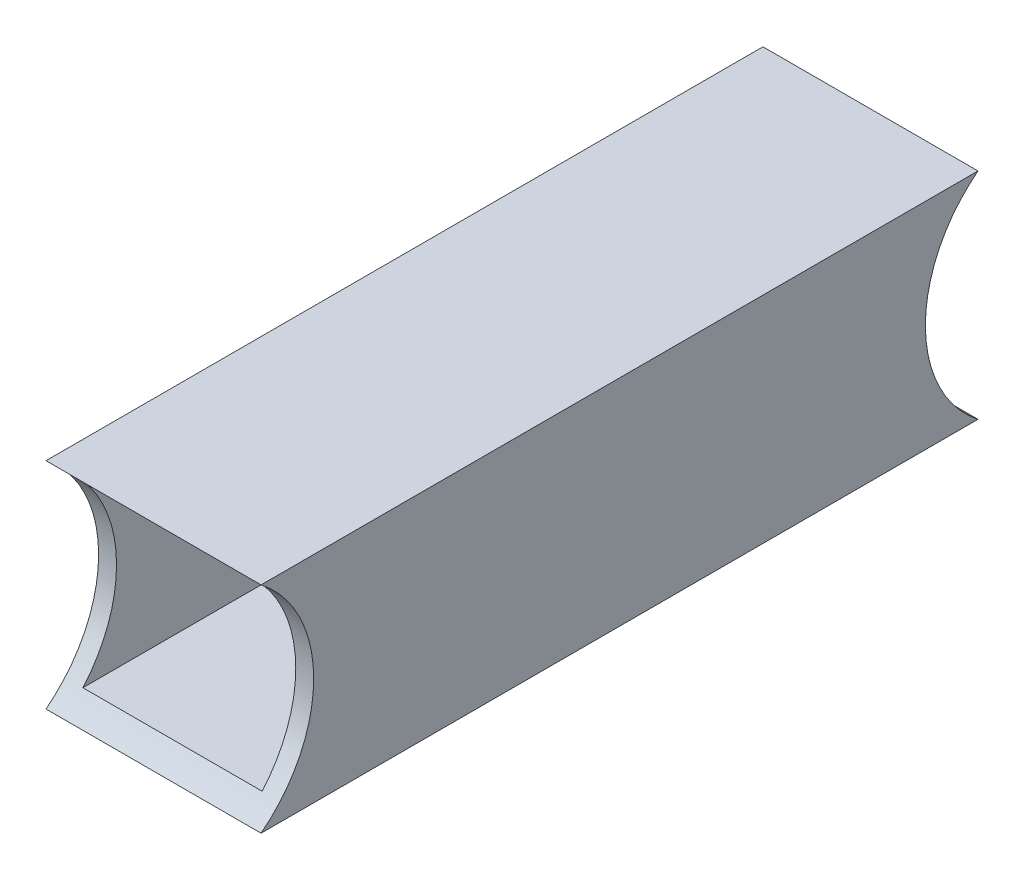
ISO-10303-21;
HEADER;
FILE_DESCRIPTION(('STEP AP214'),'2;1');
FILE_NAME('part.step','',(''),(''),'','','');
FILE_SCHEMA(('AUTOMOTIVE_DESIGN { 1 0 10303 214 1 1 1 1 }'));
ENDSEC;
DATA;
#1=APPLICATION_CONTEXT('core data for automotive mechanical design processes');
#2=APPLICATION_PROTOCOL_DEFINITION('international standard','automotive_design',2000,#1);
#3=PRODUCT_CONTEXT('',#1,'mechanical');
#4=PRODUCT('Part','Part','',(#3));
#5=PRODUCT_RELATED_PRODUCT_CATEGORY('part','',(#4));
#6=PRODUCT_DEFINITION_FORMATION('','',#4);
#7=PRODUCT_DEFINITION_CONTEXT('part definition',#1,'design');
#8=PRODUCT_DEFINITION('design','',#6,#7);
#9=PRODUCT_DEFINITION_SHAPE('','',#8);
#10=(LENGTH_UNIT() NAMED_UNIT(*) SI_UNIT(.MILLI.,.METRE.));
#11=(NAMED_UNIT(*) PLANE_ANGLE_UNIT() SI_UNIT($,.RADIAN.));
#12=(NAMED_UNIT(*) SI_UNIT($,.STERADIAN.) SOLID_ANGLE_UNIT());
#13=UNCERTAINTY_MEASURE_WITH_UNIT(LENGTH_MEASURE(1.E-05),#10,'distance_accuracy_value','');
#14=(GEOMETRIC_REPRESENTATION_CONTEXT(3) GLOBAL_UNCERTAINTY_ASSIGNED_CONTEXT((#13)) GLOBAL_UNIT_ASSIGNED_CONTEXT((#10,
#11,#12)) REPRESENTATION_CONTEXT('',''));
#15=CARTESIAN_POINT('',(0.,0.,0.));
#16=DIRECTION('',(0.,0.,1.));
#17=DIRECTION('',(1.,0.,0.));
#18=AXIS2_PLACEMENT_3D('',#15,#16,#17);
#19=CARTESIAN_POINT('',(38.1,19.05,-156.62402));
#20=DIRECTION('',(-1.,0.,0.));
#21=DIRECTION('',(0.,0.,1.));
#22=AXIS2_PLACEMENT_3D('',#19,#20,#21);
#23=CYLINDRICAL_SURFACE('',#22,24.13);
#24=DIRECTION('',(-1.,0.,0.));
#25=VECTOR('',#24,1.);
#26=CARTESIAN_POINT('',(38.1,34.925,-138.451478213007));
#27=LINE('',#26,#25);
#28=CARTESIAN_POINT('',(3.175,34.925,-138.451478213007));
#29=VERTEX_POINT('',#28);
#30=CARTESIAN_POINT('',(34.925,34.925,-138.451478213007));
#31=VERTEX_POINT('',#30);
#32=EDGE_CURVE('E106',#29,#31,#27,.F.);
#33=ORIENTED_EDGE('',*,*,#32,.F.);
#34=CARTESIAN_POINT('',(3.175,19.05,-156.62402));
#35=DIRECTION('',(-1.,0.,0.));
#36=DIRECTION('',(0.,0.,1.));
#37=AXIS2_PLACEMENT_3D('',#34,#35,#36);
#38=CIRCLE('',#37,24.13);
#39=CARTESIAN_POINT('',(3.175,3.175,-138.451478213007));
#40=VERTEX_POINT('',#39);
#41=EDGE_CURVE('E95',#40,#29,#38,.T.);
#42=ORIENTED_EDGE('',*,*,#41,.F.);
#43=DIRECTION('',(-1.,0.,0.));
#44=VECTOR('',#43,1.);
#45=CARTESIAN_POINT('',(38.1,3.175,-138.451478213007));
#46=LINE('',#45,#44);
#47=CARTESIAN_POINT('',(34.925,3.175,-138.451478213007));
#48=VERTEX_POINT('',#47);
#49=EDGE_CURVE('E100',#48,#40,#46,.T.);
#50=ORIENTED_EDGE('',*,*,#49,.F.);
#51=CARTESIAN_POINT('',(34.925,19.05,-156.62402));
#52=DIRECTION('',(1.,0.,0.));
#53=DIRECTION('',(0.,0.,-1.));
#54=AXIS2_PLACEMENT_3D('',#51,#52,#53);
#55=CIRCLE('',#54,24.13);
#56=EDGE_CURVE('E113',#31,#48,#55,.T.);
#57=ORIENTED_EDGE('',*,*,#56,.F.);
#58=EDGE_LOOP('',(#33,#42,#50,#57));
#59=FACE_BOUND('',#58,.T.);
#60=CARTESIAN_POINT('',(0.,19.05,-156.62402));
#61=DIRECTION('',(1.,0.,0.));
#62=DIRECTION('',(0.,0.,-1.));
#63=AXIS2_PLACEMENT_3D('',#60,#61,#62);
#64=CIRCLE('',#63,24.13);
#65=CARTESIAN_POINT('',(0.,38.1,-141.813402187093));
#66=VERTEX_POINT('',#65);
#67=CARTESIAN_POINT('',(0.,0.,-141.813402187093));
#68=VERTEX_POINT('',#67);
#69=EDGE_CURVE('E114',#66,#68,#64,.T.);
#70=ORIENTED_EDGE('',*,*,#69,.F.);
#71=DIRECTION('',(-1.,0.,0.));
#72=VECTOR('',#71,1.);
#73=CARTESIAN_POINT('',(38.1,38.1,-141.813402187093));
#74=LINE('',#73,#72);
#75=CARTESIAN_POINT('',(38.1,38.1,-141.813402187093));
#76=VERTEX_POINT('',#75);
#77=EDGE_CURVE('E147',#76,#66,#74,.T.);
#78=ORIENTED_EDGE('',*,*,#77,.F.);
#79=CARTESIAN_POINT('',(38.1,19.05,-156.62402));
#80=DIRECTION('',(1.,0.,0.));
#81=DIRECTION('',(0.,0.,-1.));
#82=AXIS2_PLACEMENT_3D('',#79,#80,#81);
#83=CIRCLE('',#82,24.13);
#84=CARTESIAN_POINT('',(38.1,0.,-141.813402187093));
#85=VERTEX_POINT('',#84);
#86=EDGE_CURVE('E122',#76,#85,#83,.T.);
#87=ORIENTED_EDGE('',*,*,#86,.T.);
#88=DIRECTION('',(-1.,0.,0.));
#89=VECTOR('',#88,1.);
#90=CARTESIAN_POINT('',(38.1,0.,-141.813402187093));
#91=LINE('',#90,#89);
#92=EDGE_CURVE('E133',#85,#68,#91,.T.);
#93=ORIENTED_EDGE('',*,*,#92,.T.);
#94=EDGE_LOOP('',(#70,#78,#87,#93));
#95=FACE_BOUND('',#94,.T.);
#96=ADVANCED_FACE('F35',(#59,#95),#23,.F.);
#97=CARTESIAN_POINT('',(38.1,38.1,0.));
#98=DIRECTION('',(0.,1.,0.));
#99=DIRECTION('',(0.,0.,1.));
#100=AXIS2_PLACEMENT_3D('',#97,#98,#99);
#101=PLANE('',#100);
#102=DIRECTION('',(0.,0.,-1.));
#103=VECTOR('',#102,1.);
#104=CARTESIAN_POINT('',(0.,38.1,0.));
#105=LINE('',#104,#103);
#106=CARTESIAN_POINT('',(0.,38.1,-14.8106178129071));
#107=VERTEX_POINT('',#106);
#108=EDGE_CURVE('E117',#107,#66,#105,.T.);
#109=ORIENTED_EDGE('',*,*,#108,.F.);
#110=DIRECTION('',(-1.,0.,0.));
#111=VECTOR('',#110,1.);
#112=CARTESIAN_POINT('',(38.1,38.1,-14.8106178129071));
#113=LINE('',#112,#111);
#114=CARTESIAN_POINT('',(38.1,38.1,-14.8106178129071));
#115=VERTEX_POINT('',#114);
#116=EDGE_CURVE('E145',#115,#107,#113,.T.);
#117=ORIENTED_EDGE('',*,*,#116,.F.);
#118=DIRECTION('',(0.,0.,-1.));
#119=VECTOR('',#118,1.);
#120=CARTESIAN_POINT('',(38.1,38.1,0.));
#121=LINE('',#120,#119);
#122=EDGE_CURVE('E125',#115,#76,#121,.T.);
#123=ORIENTED_EDGE('',*,*,#122,.T.);
#124=ORIENTED_EDGE('',*,*,#77,.T.);
#125=EDGE_LOOP('',(#109,#117,#123,#124));
#126=FACE_BOUND('',#125,.T.);
#127=ADVANCED_FACE('F176',(#126),#101,.T.);
#128=CARTESIAN_POINT('',(38.1,19.05,0.));
#129=DIRECTION('',(-1.,0.,0.));
#130=DIRECTION('',(0.,0.,1.));
#131=AXIS2_PLACEMENT_3D('',#128,#129,#130);
#132=CYLINDRICAL_SURFACE('',#131,24.13);
#133=DIRECTION('',(-1.,0.,0.));
#134=VECTOR('',#133,1.);
#135=CARTESIAN_POINT('',(38.1,34.925,-18.1725417869928));
#136=LINE('',#135,#134);
#137=CARTESIAN_POINT('',(34.925,34.925,-18.1725417869928));
#138=VERTEX_POINT('',#137);
#139=CARTESIAN_POINT('',(3.175,34.925,-18.1725417869928));
#140=VERTEX_POINT('',#139);
#141=EDGE_CURVE('E11',#138,#140,#136,.T.);
#142=ORIENTED_EDGE('',*,*,#141,.F.);
#143=CARTESIAN_POINT('',(34.925,19.05,0.));
#144=DIRECTION('',(1.,0.,0.));
#145=DIRECTION('',(0.,0.,-1.));
#146=AXIS2_PLACEMENT_3D('',#143,#144,#145);
#147=CIRCLE('',#146,24.13);
#148=CARTESIAN_POINT('',(34.925,3.175,-18.1725417869928));
#149=VERTEX_POINT('',#148);
#150=EDGE_CURVE('E42',#149,#138,#147,.T.);
#151=ORIENTED_EDGE('',*,*,#150,.F.);
#152=DIRECTION('',(-1.,0.,0.));
#153=VECTOR('',#152,1.);
#154=CARTESIAN_POINT('',(38.1,3.175,-18.1725417869928));
#155=LINE('',#154,#153);
#156=CARTESIAN_POINT('',(3.175,3.175,-18.1725417869928));
#157=VERTEX_POINT('',#156);
#158=EDGE_CURVE('E151',#157,#149,#155,.F.);
#159=ORIENTED_EDGE('',*,*,#158,.F.);
#160=CARTESIAN_POINT('',(3.175,19.05,0.));
#161=DIRECTION('',(-1.,0.,0.));
#162=DIRECTION('',(0.,0.,1.));
#163=AXIS2_PLACEMENT_3D('',#160,#161,#162);
#164=CIRCLE('',#163,24.13);
#165=EDGE_CURVE('E149',#140,#157,#164,.T.);
#166=ORIENTED_EDGE('',*,*,#165,.F.);
#167=EDGE_LOOP('',(#142,#151,#159,#166));
#168=FACE_BOUND('',#167,.T.);
#169=CARTESIAN_POINT('',(0.,19.05,0.));
#170=DIRECTION('',(1.,0.,0.));
#171=DIRECTION('',(0.,0.,-1.));
#172=AXIS2_PLACEMENT_3D('',#169,#170,#171);
#173=CIRCLE('',#172,24.13);
#174=CARTESIAN_POINT('',(0.,0.,-14.8106178129071));
#175=VERTEX_POINT('',#174);
#176=EDGE_CURVE('E137',#175,#107,#173,.T.);
#177=ORIENTED_EDGE('',*,*,#176,.F.);
#178=DIRECTION('',(-1.,0.,0.));
#179=VECTOR('',#178,1.);
#180=CARTESIAN_POINT('',(38.1,0.,-14.8106178129071));
#181=LINE('',#180,#179);
#182=CARTESIAN_POINT('',(38.1,0.,-14.8106178129071));
#183=VERTEX_POINT('',#182);
#184=EDGE_CURVE('E143',#183,#175,#181,.T.);
#185=ORIENTED_EDGE('',*,*,#184,.F.);
#186=CARTESIAN_POINT('',(38.1,19.05,0.));
#187=DIRECTION('',(1.,0.,0.));
#188=DIRECTION('',(0.,0.,-1.));
#189=AXIS2_PLACEMENT_3D('',#186,#187,#188);
#190=CIRCLE('',#189,24.13);
#191=EDGE_CURVE('E129',#183,#115,#190,.T.);
#192=ORIENTED_EDGE('',*,*,#191,.T.);
#193=ORIENTED_EDGE('',*,*,#116,.T.);
#194=EDGE_LOOP('',(#177,#185,#192,#193));
#195=FACE_BOUND('',#194,.T.);
#196=ADVANCED_FACE('F161',(#168,#195),#132,.F.);
#197=CARTESIAN_POINT('',(38.1,0.,0.));
#198=DIRECTION('',(0.,1.,0.));
#199=DIRECTION('',(0.,0.,1.));
#200=AXIS2_PLACEMENT_3D('',#197,#198,#199);
#201=PLANE('',#200);
#202=DIRECTION('',(0.,0.,-1.));
#203=VECTOR('',#202,1.);
#204=CARTESIAN_POINT('',(0.,0.,0.));
#205=LINE('',#204,#203);
#206=EDGE_CURVE('E126',#175,#68,#205,.T.);
#207=ORIENTED_EDGE('',*,*,#206,.T.);
#208=ORIENTED_EDGE('',*,*,#92,.F.);
#209=DIRECTION('',(0.,0.,-1.));
#210=VECTOR('',#209,1.);
#211=CARTESIAN_POINT('',(38.1,0.,0.));
#212=LINE('',#211,#210);
#213=EDGE_CURVE('E132',#183,#85,#212,.T.);
#214=ORIENTED_EDGE('',*,*,#213,.F.);
#215=ORIENTED_EDGE('',*,*,#184,.T.);
#216=EDGE_LOOP('',(#207,#208,#214,#215));
#217=FACE_BOUND('',#216,.T.);
#218=ADVANCED_FACE('F184',(#217),#201,.F.);
#219=CARTESIAN_POINT('',(38.1,0.,0.));
#220=DIRECTION('',(1.,0.,0.));
#221=DIRECTION('',(0.,0.,-1.));
#222=AXIS2_PLACEMENT_3D('',#219,#220,#221);
#223=PLANE('',#222);
#224=ORIENTED_EDGE('',*,*,#86,.F.);
#225=ORIENTED_EDGE('',*,*,#122,.F.);
#226=ORIENTED_EDGE('',*,*,#191,.F.);
#227=ORIENTED_EDGE('',*,*,#213,.T.);
#228=EDGE_LOOP('',(#224,#225,#226,#227));
#229=FACE_BOUND('',#228,.T.);
#230=ADVANCED_FACE('F190',(#229),#223,.T.);
#231=CARTESIAN_POINT('',(0.,0.,0.));
#232=DIRECTION('',(1.,0.,0.));
#233=DIRECTION('',(0.,0.,-1.));
#234=AXIS2_PLACEMENT_3D('',#231,#232,#233);
#235=PLANE('',#234);
#236=ORIENTED_EDGE('',*,*,#69,.T.);
#237=ORIENTED_EDGE('',*,*,#206,.F.);
#238=ORIENTED_EDGE('',*,*,#176,.T.);
#239=ORIENTED_EDGE('',*,*,#108,.T.);
#240=EDGE_LOOP('',(#236,#237,#238,#239));
#241=FACE_BOUND('',#240,.T.);
#242=ADVANCED_FACE('F192',(#241),#235,.F.);
#243=CARTESIAN_POINT('',(34.925,34.925,-141.813402187093));
#244=DIRECTION('',(0.,1.,0.));
#245=DIRECTION('',(0.,0.,1.));
#246=AXIS2_PLACEMENT_3D('',#243,#244,#245);
#247=PLANE('',#246);
#248=ORIENTED_EDGE('',*,*,#32,.T.);
#249=DIRECTION('',(0.,0.,1.));
#250=VECTOR('',#249,1.);
#251=CARTESIAN_POINT('',(34.925,34.925,-141.813402187093));
#252=LINE('',#251,#250);
#253=EDGE_CURVE('E101',#31,#138,#252,.T.);
#254=ORIENTED_EDGE('',*,*,#253,.T.);
#255=ORIENTED_EDGE('',*,*,#141,.T.);
#256=DIRECTION('',(0.,0.,1.));
#257=VECTOR('',#256,1.);
#258=CARTESIAN_POINT('',(3.175,34.925,-141.813402187093));
#259=LINE('',#258,#257);
#260=EDGE_CURVE('E54',#29,#140,#259,.T.);
#261=ORIENTED_EDGE('',*,*,#260,.F.);
#262=EDGE_LOOP('',(#248,#254,#255,#261));
#263=FACE_BOUND('',#262,.T.);
#264=ADVANCED_FACE('F104',(#263),#247,.F.);
#265=CARTESIAN_POINT('',(34.925,3.175,-141.813402187093));
#266=DIRECTION('',(1.,0.,0.));
#267=DIRECTION('',(0.,0.,-1.));
#268=AXIS2_PLACEMENT_3D('',#265,#266,#267);
#269=PLANE('',#268);
#270=ORIENTED_EDGE('',*,*,#56,.T.);
#271=DIRECTION('',(0.,0.,1.));
#272=VECTOR('',#271,1.);
#273=CARTESIAN_POINT('',(34.925,3.175,-141.813402187093));
#274=LINE('',#273,#272);
#275=EDGE_CURVE('E157',#48,#149,#274,.T.);
#276=ORIENTED_EDGE('',*,*,#275,.T.);
#277=ORIENTED_EDGE('',*,*,#150,.T.);
#278=ORIENTED_EDGE('',*,*,#253,.F.);
#279=EDGE_LOOP('',(#270,#276,#277,#278));
#280=FACE_BOUND('',#279,.T.);
#281=ADVANCED_FACE('F155',(#280),#269,.F.);
#282=CARTESIAN_POINT('',(3.175,3.175,-141.813402187093));
#283=DIRECTION('',(0.,-1.,0.));
#284=DIRECTION('',(0.,0.,-1.));
#285=AXIS2_PLACEMENT_3D('',#282,#283,#284);
#286=PLANE('',#285);
#287=ORIENTED_EDGE('',*,*,#49,.T.);
#288=DIRECTION('',(0.,0.,1.));
#289=VECTOR('',#288,1.);
#290=CARTESIAN_POINT('',(3.175,3.175,-141.813402187093));
#291=LINE('',#290,#289);
#292=EDGE_CURVE('E49',#40,#157,#291,.T.);
#293=ORIENTED_EDGE('',*,*,#292,.T.);
#294=ORIENTED_EDGE('',*,*,#158,.T.);
#295=ORIENTED_EDGE('',*,*,#275,.F.);
#296=EDGE_LOOP('',(#287,#293,#294,#295));
#297=FACE_BOUND('',#296,.T.);
#298=ADVANCED_FACE('F164',(#297),#286,.F.);
#299=CARTESIAN_POINT('',(3.175,34.925,-141.813402187093));
#300=DIRECTION('',(-1.,0.,0.));
#301=DIRECTION('',(0.,0.,1.));
#302=AXIS2_PLACEMENT_3D('',#299,#300,#301);
#303=PLANE('',#302);
#304=ORIENTED_EDGE('',*,*,#41,.T.);
#305=ORIENTED_EDGE('',*,*,#260,.T.);
#306=ORIENTED_EDGE('',*,*,#165,.T.);
#307=ORIENTED_EDGE('',*,*,#292,.F.);
#308=EDGE_LOOP('',(#304,#305,#306,#307));
#309=FACE_BOUND('',#308,.T.);
#310=ADVANCED_FACE('F96',(#309),#303,.F.);
#311=CLOSED_SHELL('',(#96,#127,#196,#218,#230,#242,#264,#281,#298,#310));
#312=MANIFOLD_SOLID_BREP('B2',#311);
#313=ADVANCED_BREP_SHAPE_REPRESENTATION('',(#18,#312),#14);
#314=SHAPE_DEFINITION_REPRESENTATION(#9,#313);
ENDSEC;
END-ISO-10303-21;
